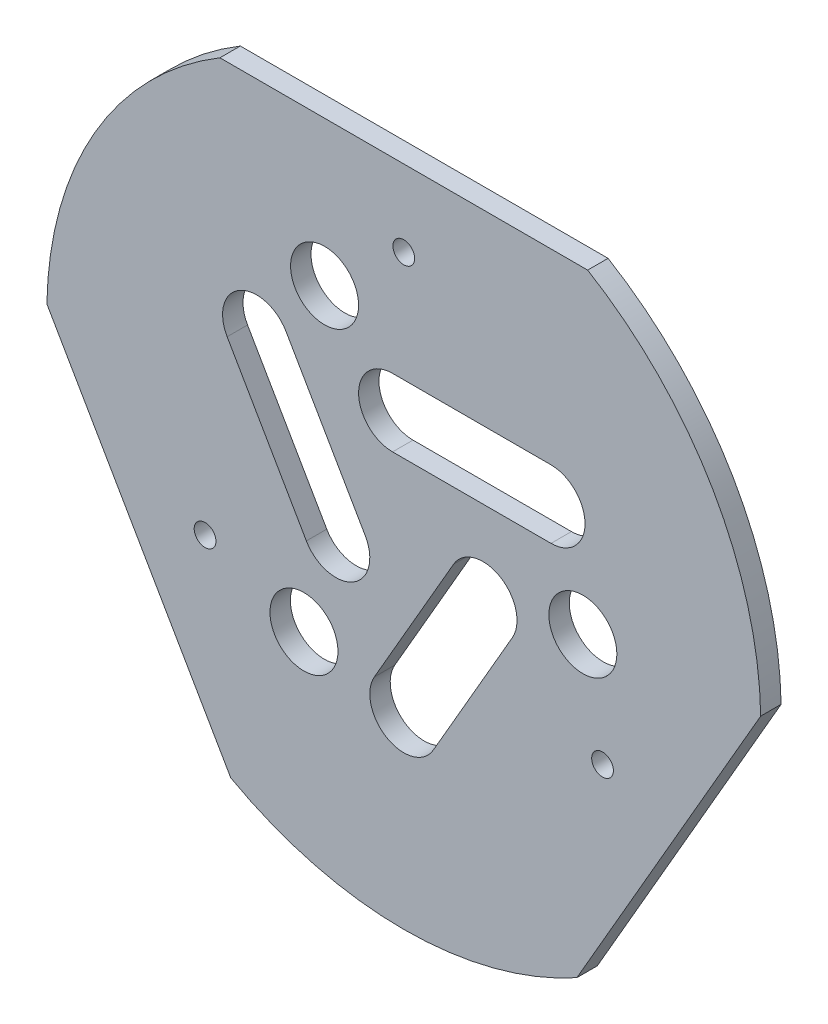
ISO-10303-21;
HEADER;
FILE_DESCRIPTION(('STEP AP214'),'2;1');
FILE_NAME('part.step','',(''),(''),'','','');
FILE_SCHEMA(('AUTOMOTIVE_DESIGN { 1 0 10303 214 1 1 1 1 }'));
ENDSEC;
DATA;
#1=APPLICATION_CONTEXT('core data for automotive mechanical design processes');
#2=APPLICATION_PROTOCOL_DEFINITION('international standard','automotive_design',2000,#1);
#3=PRODUCT_CONTEXT('',#1,'mechanical');
#4=PRODUCT('Part','Part','',(#3));
#5=PRODUCT_RELATED_PRODUCT_CATEGORY('part','',(#4));
#6=PRODUCT_DEFINITION_FORMATION('','',#4);
#7=PRODUCT_DEFINITION_CONTEXT('part definition',#1,'design');
#8=PRODUCT_DEFINITION('design','',#6,#7);
#9=PRODUCT_DEFINITION_SHAPE('','',#8);
#10=(LENGTH_UNIT() NAMED_UNIT(*) SI_UNIT(.MILLI.,.METRE.));
#11=(NAMED_UNIT(*) PLANE_ANGLE_UNIT() SI_UNIT($,.RADIAN.));
#12=(NAMED_UNIT(*) SI_UNIT($,.STERADIAN.) SOLID_ANGLE_UNIT());
#13=UNCERTAINTY_MEASURE_WITH_UNIT(LENGTH_MEASURE(1.E-05),#10,'distance_accuracy_value','');
#14=(GEOMETRIC_REPRESENTATION_CONTEXT(3) GLOBAL_UNCERTAINTY_ASSIGNED_CONTEXT((#13)) GLOBAL_UNIT_ASSIGNED_CONTEXT((#10,
#11,#12)) REPRESENTATION_CONTEXT('',''));
#15=CARTESIAN_POINT('',(0.,0.,0.));
#16=DIRECTION('',(0.,0.,1.));
#17=DIRECTION('',(1.,0.,0.));
#18=AXIS2_PLACEMENT_3D('',#15,#16,#17);
#19=CARTESIAN_POINT('',(0.,0.,1.5));
#20=DIRECTION('',(0.,0.,1.));
#21=DIRECTION('',(1.,0.,0.));
#22=AXIS2_PLACEMENT_3D('',#19,#20,#21);
#23=PLANE('',#22);
#24=CARTESIAN_POINT('',(-14.6824583655185,-21.9299159059052,1.5));
#25=DIRECTION('',(0.,0.,1.));
#26=DIRECTION('',(-0.500000000000004,0.866025403784436,0.));
#27=AXIS2_PLACEMENT_3D('',#24,#25,#26);
#28=CIRCLE('',#27,5.);
#29=CARTESIAN_POINT('',(-17.1824583655185,-17.599788886983,1.5));
#30=VERTEX_POINT('',#29);
#31=EDGE_CURVE('E442',#30,#30,#28,.T.);
#32=ORIENTED_EDGE('',*,*,#31,.F.);
#33=EDGE_LOOP('',(#32));
#34=FACE_BOUND('',#33,.T.);
#35=CARTESIAN_POINT('',(26.3330934601296,-1.75042398159359,1.5));
#36=DIRECTION('',(0.,0.,1.));
#37=DIRECTION('',(-0.499999999999992,-0.866025403784443,0.));
#38=AXIS2_PLACEMENT_3D('',#35,#36,#37);
#39=CIRCLE('',#38,5.);
#40=CARTESIAN_POINT('',(23.8330934601296,-6.08055100051581,1.5));
#41=VERTEX_POINT('',#40);
#42=EDGE_CURVE('E447',#41,#41,#39,.T.);
#43=ORIENTED_EDGE('',*,*,#42,.F.);
#44=EDGE_LOOP('',(#43));
#45=FACE_BOUND('',#44,.T.);
#46=CARTESIAN_POINT('',(-11.650635094611,23.680339887499,1.5));
#47=DIRECTION('',(0.,0.,1.));
#48=DIRECTION('',(1.,0.,0.));
#49=AXIS2_PLACEMENT_3D('',#46,#47,#48);
#50=CIRCLE('',#49,5.);
#51=CARTESIAN_POINT('',(-6.65063509461102,23.680339887499,1.5));
#52=VERTEX_POINT('',#51);
#53=EDGE_CURVE('E187',#52,#52,#50,.T.);
#54=ORIENTED_EDGE('',*,*,#53,.F.);
#55=EDGE_LOOP('',(#54));
#56=FACE_BOUND('',#55,.T.);
#57=DIRECTION('',(-0.499999999999996,-0.866025403784441,0.));
#58=VECTOR('',#57,1.);
#59=CARTESIAN_POINT('',(-4.33012701892209,-22.5,1.5));
#60=LINE('',#59,#58);
#61=CARTESIAN_POINT('',(7.32050807568879,-2.32050807568874,1.5));
#62=VERTEX_POINT('',#61);
#63=CARTESIAN_POINT('',(-4.33012701892209,-22.5,1.5));
#64=VERTEX_POINT('',#63);
#65=EDGE_CURVE('E182',#62,#64,#60,.T.);
#66=ORIENTED_EDGE('',*,*,#65,.F.);
#67=CARTESIAN_POINT('',(11.650635094611,-4.82050807568872,1.5));
#68=DIRECTION('',(0.,0.,1.));
#69=DIRECTION('',(-0.500000000000004,0.866025403784436,0.));
#70=AXIS2_PLACEMENT_3D('',#67,#68,#69);
#71=CIRCLE('',#70,5.);
#72=CARTESIAN_POINT('',(15.9807621135332,-7.3205080756887,1.5));
#73=VERTEX_POINT('',#72);
#74=EDGE_CURVE('E184',#73,#62,#71,.T.);
#75=ORIENTED_EDGE('',*,*,#74,.F.);
#76=DIRECTION('',(0.499999999999996,0.866025403784441,0.));
#77=VECTOR('',#76,1.);
#78=CARTESIAN_POINT('',(4.33012701892233,-27.5,1.5));
#79=LINE('',#78,#77);
#80=CARTESIAN_POINT('',(4.33012701892233,-27.5,1.5));
#81=VERTEX_POINT('',#80);
#82=EDGE_CURVE('E162',#81,#73,#79,.T.);
#83=ORIENTED_EDGE('',*,*,#82,.F.);
#84=CARTESIAN_POINT('',(0.,-25.,1.5));
#85=DIRECTION('',(0.,0.,1.));
#86=DIRECTION('',(1.,0.,0.));
#87=AXIS2_PLACEMENT_3D('',#84,#85,#86);
#88=CIRCLE('',#87,5.);
#89=EDGE_CURVE('E261',#64,#81,#88,.T.);
#90=ORIENTED_EDGE('',*,*,#89,.F.);
#91=EDGE_LOOP('',(#66,#75,#83,#90));
#92=FACE_BOUND('',#91,.T.);
#93=DIRECTION('',(1.,0.,0.));
#94=VECTOR('',#93,1.);
#95=CARTESIAN_POINT('',(21.6506350946109,7.5000000000002,1.5));
#96=LINE('',#95,#94);
#97=CARTESIAN_POINT('',(-1.65063509461104,7.49999999999998,1.5));
#98=VERTEX_POINT('',#97);
#99=CARTESIAN_POINT('',(21.6506350946109,7.5000000000002,1.5));
#100=VERTEX_POINT('',#99);
#101=EDGE_CURVE('E202',#98,#100,#96,.T.);
#102=ORIENTED_EDGE('',*,*,#101,.F.);
#103=CARTESIAN_POINT('',(-1.65063509461108,12.5,1.5));
#104=DIRECTION('',(0.,0.,1.));
#105=DIRECTION('',(-0.499999999999992,-0.866025403784443,0.));
#106=AXIS2_PLACEMENT_3D('',#103,#104,#105);
#107=CIRCLE('',#106,5.);
#108=CARTESIAN_POINT('',(-1.65063509461113,17.5,1.5));
#109=VERTEX_POINT('',#108);
#110=EDGE_CURVE('E212',#109,#98,#107,.T.);
#111=ORIENTED_EDGE('',*,*,#110,.F.);
#112=DIRECTION('',(-1.,0.,0.));
#113=VECTOR('',#112,1.);
#114=CARTESIAN_POINT('',(21.6506350946108,17.5000000000002,1.5));
#115=LINE('',#114,#113);
#116=CARTESIAN_POINT('',(21.6506350946108,17.5000000000002,1.5));
#117=VERTEX_POINT('',#116);
#118=EDGE_CURVE('E209',#117,#109,#115,.T.);
#119=ORIENTED_EDGE('',*,*,#118,.F.);
#120=CARTESIAN_POINT('',(21.650635094611,12.5,1.5));
#121=DIRECTION('',(0.,0.,1.));
#122=DIRECTION('',(1.,0.,0.));
#123=AXIS2_PLACEMENT_3D('',#120,#121,#122);
#124=CIRCLE('',#123,5.);
#125=EDGE_CURVE('E250',#100,#117,#124,.T.);
#126=ORIENTED_EDGE('',*,*,#125,.F.);
#127=EDGE_LOOP('',(#102,#111,#119,#126));
#128=FACE_BOUND('',#127,.T.);
#129=DIRECTION('',(-0.5,0.866025403784439,0.));
#130=VECTOR('',#129,1.);
#131=CARTESIAN_POINT('',(-17.3205080756888,15.,1.5));
#132=LINE('',#131,#130);
#133=CARTESIAN_POINT('',(-5.66987298107781,-5.17949192431123,1.5));
#134=VERTEX_POINT('',#133);
#135=CARTESIAN_POINT('',(-17.3205080756888,15.,1.5));
#136=VERTEX_POINT('',#135);
#137=EDGE_CURVE('E228',#134,#136,#132,.T.);
#138=ORIENTED_EDGE('',*,*,#137,.F.);
#139=CARTESIAN_POINT('',(-10.,-7.67949192431123,1.5));
#140=DIRECTION('',(0.,0.,1.));
#141=DIRECTION('',(1.,0.,0.));
#142=AXIS2_PLACEMENT_3D('',#139,#140,#141);
#143=CIRCLE('',#142,5.);
#144=CARTESIAN_POINT('',(-14.3301270189222,-10.1794919243112,1.5));
#145=VERTEX_POINT('',#144);
#146=EDGE_CURVE('E237',#145,#134,#143,.T.);
#147=ORIENTED_EDGE('',*,*,#146,.F.);
#148=DIRECTION('',(0.5,-0.866025403784438,0.));
#149=VECTOR('',#148,1.);
#150=CARTESIAN_POINT('',(-25.9807621135332,9.99999999999999,1.5));
#151=LINE('',#150,#149);
#152=CARTESIAN_POINT('',(-25.9807621135332,9.99999999999999,1.5));
#153=VERTEX_POINT('',#152);
#154=EDGE_CURVE('E197',#153,#145,#151,.T.);
#155=ORIENTED_EDGE('',*,*,#154,.F.);
#156=CARTESIAN_POINT('',(-21.650635094611,12.5,1.5));
#157=DIRECTION('',(0.,0.,1.));
#158=DIRECTION('',(1.,0.,0.));
#159=AXIS2_PLACEMENT_3D('',#156,#157,#158);
#160=CIRCLE('',#159,5.);
#161=EDGE_CURVE('E256',#136,#153,#160,.T.);
#162=ORIENTED_EDGE('',*,*,#161,.F.);
#163=EDGE_LOOP('',(#138,#147,#155,#162));
#164=FACE_BOUND('',#163,.T.);
#165=CARTESIAN_POINT('',(-29.2283573777248,-16.875,1.5));
#166=DIRECTION('',(0.,0.,1.));
#167=DIRECTION('',(1.,0.,0.));
#168=AXIS2_PLACEMENT_3D('',#165,#166,#167);
#169=CIRCLE('',#168,1.6);
#170=CARTESIAN_POINT('',(-27.6283573777248,-16.875,1.5));
#171=VERTEX_POINT('',#170);
#172=EDGE_CURVE('E266',#171,#171,#169,.T.);
#173=ORIENTED_EDGE('',*,*,#172,.F.);
#174=EDGE_LOOP('',(#173));
#175=FACE_BOUND('',#174,.T.);
#176=CARTESIAN_POINT('',(0.,33.75,1.5));
#177=DIRECTION('',(0.,0.,1.));
#178=DIRECTION('',(1.,0.,0.));
#179=AXIS2_PLACEMENT_3D('',#176,#177,#178);
#180=CIRCLE('',#179,1.6);
#181=CARTESIAN_POINT('',(1.6,33.75,1.5));
#182=VERTEX_POINT('',#181);
#183=EDGE_CURVE('E278',#182,#182,#180,.T.);
#184=ORIENTED_EDGE('',*,*,#183,.F.);
#185=EDGE_LOOP('',(#184));
#186=FACE_BOUND('',#185,.T.);
#187=CARTESIAN_POINT('',(0.,0.,1.5));
#188=DIRECTION('',(0.,0.,1.));
#189=DIRECTION('',(1.,0.,0.));
#190=AXIS2_PLACEMENT_3D('',#187,#188,#189);
#191=CIRCLE('',#190,52.5);
#192=CARTESIAN_POINT('',(-27.0416345659799,45.,1.5));
#193=VERTEX_POINT('',#192);
#194=CARTESIAN_POINT('',(-52.4919604532897,0.91874249399394,1.5));
#195=VERTEX_POINT('',#194);
#196=EDGE_CURVE('E284',#193,#195,#191,.T.);
#197=ORIENTED_EDGE('',*,*,#196,.T.);
#198=DIRECTION('',(0.500000000000001,-0.866025403784438,0.));
#199=VECTOR('',#198,1.);
#200=CARTESIAN_POINT('',(-52.4919604532897,0.91874249399394,1.5));
#201=LINE('',#200,#199);
#202=CARTESIAN_POINT('',(-25.4503258873098,-45.918742493994,1.5));
#203=VERTEX_POINT('',#202);
#204=EDGE_CURVE('E287',#195,#203,#201,.T.);
#205=ORIENTED_EDGE('',*,*,#204,.T.);
#206=CARTESIAN_POINT('',(0.,0.,1.5));
#207=DIRECTION('',(0.,0.,1.));
#208=DIRECTION('',(1.,0.,0.));
#209=AXIS2_PLACEMENT_3D('',#206,#207,#208);
#210=CIRCLE('',#209,52.5);
#211=CARTESIAN_POINT('',(25.4503258873098,-45.918742493994,1.5));
#212=VERTEX_POINT('',#211);
#213=EDGE_CURVE('E290',#203,#212,#210,.T.);
#214=ORIENTED_EDGE('',*,*,#213,.T.);
#215=DIRECTION('',(0.5,0.866025403784439,0.));
#216=VECTOR('',#215,1.);
#217=CARTESIAN_POINT('',(25.4503258873098,-45.918742493994,1.5));
#218=LINE('',#217,#216);
#219=CARTESIAN_POINT('',(52.4919604532897,0.918742493994013,1.5));
#220=VERTEX_POINT('',#219);
#221=EDGE_CURVE('E292',#212,#220,#218,.T.);
#222=ORIENTED_EDGE('',*,*,#221,.T.);
#223=CARTESIAN_POINT('',(0.,0.,1.5));
#224=DIRECTION('',(0.,0.,1.));
#225=DIRECTION('',(1.,0.,0.));
#226=AXIS2_PLACEMENT_3D('',#223,#224,#225);
#227=CIRCLE('',#226,52.5);
#228=CARTESIAN_POINT('',(27.0416345659799,45.,1.5));
#229=VERTEX_POINT('',#228);
#230=EDGE_CURVE('E294',#220,#229,#227,.T.);
#231=ORIENTED_EDGE('',*,*,#230,.T.);
#232=DIRECTION('',(-1.,0.,0.));
#233=VECTOR('',#232,1.);
#234=CARTESIAN_POINT('',(27.0416345659799,45.,1.5));
#235=LINE('',#234,#233);
#236=EDGE_CURVE('E296',#229,#193,#235,.T.);
#237=ORIENTED_EDGE('',*,*,#236,.T.);
#238=EDGE_LOOP('',(#197,#205,#214,#222,#231,#237));
#239=FACE_BOUND('',#238,.T.);
#240=CARTESIAN_POINT('',(29.2283573777248,-16.875,1.5));
#241=DIRECTION('',(0.,0.,1.));
#242=DIRECTION('',(1.,0.,0.));
#243=AXIS2_PLACEMENT_3D('',#240,#241,#242);
#244=CIRCLE('',#243,1.6);
#245=CARTESIAN_POINT('',(30.8283573777248,-16.875,1.5));
#246=VERTEX_POINT('',#245);
#247=EDGE_CURVE('E272',#246,#246,#244,.T.);
#248=ORIENTED_EDGE('',*,*,#247,.F.);
#249=EDGE_LOOP('',(#248));
#250=FACE_BOUND('',#249,.T.);
#251=ADVANCED_FACE('F35',(#34,#45,#56,#92,#128,#164,#175,#186,#239,#250),#23,.T.);
#252=CARTESIAN_POINT('',(0.,0.,-1.5));
#253=DIRECTION('',(0.,0.,1.));
#254=DIRECTION('',(1.,0.,0.));
#255=AXIS2_PLACEMENT_3D('',#252,#253,#254);
#256=PLANE('',#255);
#257=CARTESIAN_POINT('',(-14.6824583655185,-21.9299159059052,-1.5));
#258=DIRECTION('',(0.,0.,1.));
#259=DIRECTION('',(-0.500000000000004,0.866025403784436,0.));
#260=AXIS2_PLACEMENT_3D('',#257,#258,#259);
#261=CIRCLE('',#260,5.);
#262=CARTESIAN_POINT('',(-17.1824583655185,-17.599788886983,-1.5));
#263=VERTEX_POINT('',#262);
#264=EDGE_CURVE('E440',#263,#263,#261,.T.);
#265=ORIENTED_EDGE('',*,*,#264,.T.);
#266=EDGE_LOOP('',(#265));
#267=FACE_BOUND('',#266,.T.);
#268=CARTESIAN_POINT('',(26.3330934601296,-1.75042398159359,-1.5));
#269=DIRECTION('',(0.,0.,1.));
#270=DIRECTION('',(-0.499999999999992,-0.866025403784443,0.));
#271=AXIS2_PLACEMENT_3D('',#268,#269,#270);
#272=CIRCLE('',#271,5.);
#273=CARTESIAN_POINT('',(23.8330934601296,-6.08055100051581,-1.5));
#274=VERTEX_POINT('',#273);
#275=EDGE_CURVE('E443',#274,#274,#272,.T.);
#276=ORIENTED_EDGE('',*,*,#275,.T.);
#277=EDGE_LOOP('',(#276));
#278=FACE_BOUND('',#277,.T.);
#279=CARTESIAN_POINT('',(-11.650635094611,23.680339887499,-1.5));
#280=DIRECTION('',(0.,0.,1.));
#281=DIRECTION('',(1.,0.,0.));
#282=AXIS2_PLACEMENT_3D('',#279,#280,#281);
#283=CIRCLE('',#282,5.);
#284=CARTESIAN_POINT('',(-6.65063509461102,23.680339887499,-1.5));
#285=VERTEX_POINT('',#284);
#286=EDGE_CURVE('E213',#285,#285,#283,.T.);
#287=ORIENTED_EDGE('',*,*,#286,.T.);
#288=EDGE_LOOP('',(#287));
#289=FACE_BOUND('',#288,.T.);
#290=CARTESIAN_POINT('',(0.,0.,-1.5));
#291=DIRECTION('',(0.,0.,1.));
#292=DIRECTION('',(1.,0.,0.));
#293=AXIS2_PLACEMENT_3D('',#290,#291,#292);
#294=CIRCLE('',#293,52.5);
#295=CARTESIAN_POINT('',(-27.0416345659799,45.,-1.5));
#296=VERTEX_POINT('',#295);
#297=CARTESIAN_POINT('',(-52.4919604532897,0.91874249399394,-1.5));
#298=VERTEX_POINT('',#297);
#299=EDGE_CURVE('E281',#296,#298,#294,.T.);
#300=ORIENTED_EDGE('',*,*,#299,.F.);
#301=DIRECTION('',(-1.,0.,0.));
#302=VECTOR('',#301,1.);
#303=CARTESIAN_POINT('',(27.0416345659799,45.,-1.5));
#304=LINE('',#303,#302);
#305=CARTESIAN_POINT('',(27.0416345659799,45.,-1.5));
#306=VERTEX_POINT('',#305);
#307=EDGE_CURVE('E288',#306,#296,#304,.T.);
#308=ORIENTED_EDGE('',*,*,#307,.F.);
#309=CARTESIAN_POINT('',(0.,0.,-1.5));
#310=DIRECTION('',(0.,0.,1.));
#311=DIRECTION('',(1.,0.,0.));
#312=AXIS2_PLACEMENT_3D('',#309,#310,#311);
#313=CIRCLE('',#312,52.5);
#314=CARTESIAN_POINT('',(52.4919604532897,0.918742493994013,-1.5));
#315=VERTEX_POINT('',#314);
#316=EDGE_CURVE('E307',#315,#306,#313,.T.);
#317=ORIENTED_EDGE('',*,*,#316,.F.);
#318=DIRECTION('',(0.5,0.866025403784439,0.));
#319=VECTOR('',#318,1.);
#320=CARTESIAN_POINT('',(25.4503258873098,-45.918742493994,-1.5));
#321=LINE('',#320,#319);
#322=CARTESIAN_POINT('',(25.4503258873098,-45.918742493994,-1.5));
#323=VERTEX_POINT('',#322);
#324=EDGE_CURVE('E305',#323,#315,#321,.T.);
#325=ORIENTED_EDGE('',*,*,#324,.F.);
#326=CARTESIAN_POINT('',(0.,0.,-1.5));
#327=DIRECTION('',(0.,0.,1.));
#328=DIRECTION('',(1.,0.,0.));
#329=AXIS2_PLACEMENT_3D('',#326,#327,#328);
#330=CIRCLE('',#329,52.5);
#331=CARTESIAN_POINT('',(-25.4503258873098,-45.918742493994,-1.5));
#332=VERTEX_POINT('',#331);
#333=EDGE_CURVE('E303',#332,#323,#330,.T.);
#334=ORIENTED_EDGE('',*,*,#333,.F.);
#335=DIRECTION('',(0.500000000000001,-0.866025403784438,0.));
#336=VECTOR('',#335,1.);
#337=CARTESIAN_POINT('',(-52.4919604532897,0.91874249399394,-1.5));
#338=LINE('',#337,#336);
#339=EDGE_CURVE('E301',#298,#332,#338,.T.);
#340=ORIENTED_EDGE('',*,*,#339,.F.);
#341=EDGE_LOOP('',(#300,#308,#317,#325,#334,#340));
#342=FACE_BOUND('',#341,.T.);
#343=CARTESIAN_POINT('',(0.,33.75,-1.5));
#344=DIRECTION('',(0.,0.,1.));
#345=DIRECTION('',(1.,0.,0.));
#346=AXIS2_PLACEMENT_3D('',#343,#344,#345);
#347=CIRCLE('',#346,1.6);
#348=CARTESIAN_POINT('',(1.6,33.75,-1.5));
#349=VERTEX_POINT('',#348);
#350=EDGE_CURVE('E275',#349,#349,#347,.T.);
#351=ORIENTED_EDGE('',*,*,#350,.T.);
#352=EDGE_LOOP('',(#351));
#353=FACE_BOUND('',#352,.T.);
#354=CARTESIAN_POINT('',(29.2283573777248,-16.875,-1.5));
#355=DIRECTION('',(0.,0.,1.));
#356=DIRECTION('',(1.,0.,0.));
#357=AXIS2_PLACEMENT_3D('',#354,#355,#356);
#358=CIRCLE('',#357,1.6);
#359=CARTESIAN_POINT('',(30.8283573777248,-16.875,-1.5));
#360=VERTEX_POINT('',#359);
#361=EDGE_CURVE('E269',#360,#360,#358,.T.);
#362=ORIENTED_EDGE('',*,*,#361,.T.);
#363=EDGE_LOOP('',(#362));
#364=FACE_BOUND('',#363,.T.);
#365=CARTESIAN_POINT('',(-29.2283573777248,-16.875,-1.5));
#366=DIRECTION('',(0.,0.,1.));
#367=DIRECTION('',(1.,0.,0.));
#368=AXIS2_PLACEMENT_3D('',#365,#366,#367);
#369=CIRCLE('',#368,1.6);
#370=CARTESIAN_POINT('',(-27.6283573777248,-16.875,-1.5));
#371=VERTEX_POINT('',#370);
#372=EDGE_CURVE('E264',#371,#371,#369,.T.);
#373=ORIENTED_EDGE('',*,*,#372,.T.);
#374=EDGE_LOOP('',(#373));
#375=FACE_BOUND('',#374,.T.);
#376=CARTESIAN_POINT('',(11.650635094611,-4.82050807568872,-1.5));
#377=DIRECTION('',(0.,0.,1.));
#378=DIRECTION('',(-0.500000000000004,0.866025403784436,0.));
#379=AXIS2_PLACEMENT_3D('',#376,#377,#378);
#380=CIRCLE('',#379,5.);
#381=CARTESIAN_POINT('',(15.9807621135332,-7.3205080756887,-1.5));
#382=VERTEX_POINT('',#381);
#383=CARTESIAN_POINT('',(7.32050807568879,-2.32050807568874,-1.5));
#384=VERTEX_POINT('',#383);
#385=EDGE_CURVE('E170',#382,#384,#380,.T.);
#386=ORIENTED_EDGE('',*,*,#385,.T.);
#387=DIRECTION('',(-0.499999999999996,-0.866025403784441,0.));
#388=VECTOR('',#387,1.);
#389=CARTESIAN_POINT('',(-4.33012701892209,-22.5,-1.5));
#390=LINE('',#389,#388);
#391=CARTESIAN_POINT('',(-4.33012701892209,-22.5,-1.5));
#392=VERTEX_POINT('',#391);
#393=EDGE_CURVE('E175',#384,#392,#390,.T.);
#394=ORIENTED_EDGE('',*,*,#393,.T.);
#395=CARTESIAN_POINT('',(0.,-25.,-1.5));
#396=DIRECTION('',(0.,0.,1.));
#397=DIRECTION('',(1.,0.,0.));
#398=AXIS2_PLACEMENT_3D('',#395,#396,#397);
#399=CIRCLE('',#398,5.);
#400=CARTESIAN_POINT('',(4.33012701892223,-27.4999999999999,-1.5));
#401=VERTEX_POINT('',#400);
#402=EDGE_CURVE('E181',#392,#401,#399,.T.);
#403=ORIENTED_EDGE('',*,*,#402,.T.);
#404=DIRECTION('',(0.499999999999996,0.866025403784441,0.));
#405=VECTOR('',#404,1.);
#406=CARTESIAN_POINT('',(4.33012701892233,-27.5,-1.5));
#407=LINE('',#406,#405);
#408=EDGE_CURVE('E50',#401,#382,#407,.T.);
#409=ORIENTED_EDGE('',*,*,#408,.T.);
#410=EDGE_LOOP('',(#386,#394,#403,#409));
#411=FACE_BOUND('',#410,.T.);
#412=CARTESIAN_POINT('',(-10.,-7.67949192431123,-1.5));
#413=DIRECTION('',(0.,0.,1.));
#414=DIRECTION('',(1.,0.,0.));
#415=AXIS2_PLACEMENT_3D('',#412,#413,#414);
#416=CIRCLE('',#415,5.);
#417=CARTESIAN_POINT('',(-14.3301270189222,-10.1794919243112,-1.5));
#418=VERTEX_POINT('',#417);
#419=CARTESIAN_POINT('',(-5.66987298107781,-5.17949192431123,-1.5));
#420=VERTEX_POINT('',#419);
#421=EDGE_CURVE('E227',#418,#420,#416,.T.);
#422=ORIENTED_EDGE('',*,*,#421,.T.);
#423=DIRECTION('',(-0.5,0.866025403784439,0.));
#424=VECTOR('',#423,1.);
#425=CARTESIAN_POINT('',(-17.3205080756888,15.,-1.5));
#426=LINE('',#425,#424);
#427=CARTESIAN_POINT('',(-17.3205080756888,15.,-1.5));
#428=VERTEX_POINT('',#427);
#429=EDGE_CURVE('E231',#420,#428,#426,.T.);
#430=ORIENTED_EDGE('',*,*,#429,.T.);
#431=CARTESIAN_POINT('',(-21.650635094611,12.5,-1.5));
#432=DIRECTION('',(0.,0.,1.));
#433=DIRECTION('',(1.,0.,0.));
#434=AXIS2_PLACEMENT_3D('',#431,#432,#433);
#435=CIRCLE('',#434,5.);
#436=CARTESIAN_POINT('',(-25.9807621135332,9.99999999999999,-1.5));
#437=VERTEX_POINT('',#436);
#438=EDGE_CURVE('E253',#428,#437,#435,.T.);
#439=ORIENTED_EDGE('',*,*,#438,.T.);
#440=DIRECTION('',(0.5,-0.866025403784438,0.));
#441=VECTOR('',#440,1.);
#442=CARTESIAN_POINT('',(-25.9807621135332,9.99999999999999,-1.5));
#443=LINE('',#442,#441);
#444=EDGE_CURVE('E224',#437,#418,#443,.T.);
#445=ORIENTED_EDGE('',*,*,#444,.T.);
#446=EDGE_LOOP('',(#422,#430,#439,#445));
#447=FACE_BOUND('',#446,.T.);
#448=CARTESIAN_POINT('',(-1.65063509461108,12.5,-1.5));
#449=DIRECTION('',(0.,0.,1.));
#450=DIRECTION('',(-0.499999999999992,-0.866025403784443,0.));
#451=AXIS2_PLACEMENT_3D('',#448,#449,#450);
#452=CIRCLE('',#451,5.);
#453=CARTESIAN_POINT('',(-1.65063509461113,17.5,-1.5));
#454=VERTEX_POINT('',#453);
#455=CARTESIAN_POINT('',(-1.65063509461104,7.49999999999998,-1.5));
#456=VERTEX_POINT('',#455);
#457=EDGE_CURVE('E201',#454,#456,#452,.T.);
#458=ORIENTED_EDGE('',*,*,#457,.T.);
#459=DIRECTION('',(1.,0.,0.));
#460=VECTOR('',#459,1.);
#461=CARTESIAN_POINT('',(21.6506350946109,7.5000000000002,-1.5));
#462=LINE('',#461,#460);
#463=CARTESIAN_POINT('',(21.6506350946109,7.5000000000002,-1.5));
#464=VERTEX_POINT('',#463);
#465=EDGE_CURVE('E205',#456,#464,#462,.T.);
#466=ORIENTED_EDGE('',*,*,#465,.T.);
#467=CARTESIAN_POINT('',(21.650635094611,12.5,-1.5));
#468=DIRECTION('',(0.,0.,1.));
#469=DIRECTION('',(1.,0.,0.));
#470=AXIS2_PLACEMENT_3D('',#467,#468,#469);
#471=CIRCLE('',#470,5.);
#472=CARTESIAN_POINT('',(21.6506350946108,17.5,-1.5));
#473=VERTEX_POINT('',#472);
#474=EDGE_CURVE('E244',#464,#473,#471,.T.);
#475=ORIENTED_EDGE('',*,*,#474,.T.);
#476=DIRECTION('',(-1.,0.,0.));
#477=VECTOR('',#476,1.);
#478=CARTESIAN_POINT('',(21.6506350946108,17.5000000000002,-1.5));
#479=LINE('',#478,#477);
#480=EDGE_CURVE('E58',#473,#454,#479,.T.);
#481=ORIENTED_EDGE('',*,*,#480,.T.);
#482=EDGE_LOOP('',(#458,#466,#475,#481));
#483=FACE_BOUND('',#482,.T.);
#484=ADVANCED_FACE('F178',(#267,#278,#289,#342,#353,#364,#375,#411,#447,#483),#256,.F.);
#485=CARTESIAN_POINT('',(0.,0.,1.5));
#486=DIRECTION('',(0.,0.,-1.));
#487=DIRECTION('',(-1.,0.,0.));
#488=AXIS2_PLACEMENT_3D('',#485,#486,#487);
#489=CYLINDRICAL_SURFACE('',#488,52.5);
#490=ORIENTED_EDGE('',*,*,#299,.T.);
#491=DIRECTION('',(0.,0.,-1.));
#492=VECTOR('',#491,1.);
#493=CARTESIAN_POINT('',(-52.4919604532897,0.91874249399394,1.5));
#494=LINE('',#493,#492);
#495=EDGE_CURVE('E11',#195,#298,#494,.T.);
#496=ORIENTED_EDGE('',*,*,#495,.F.);
#497=ORIENTED_EDGE('',*,*,#196,.F.);
#498=DIRECTION('',(0.,0.,-1.));
#499=VECTOR('',#498,1.);
#500=CARTESIAN_POINT('',(-27.0416345659799,45.,1.5));
#501=LINE('',#500,#499);
#502=EDGE_CURVE('E298',#193,#296,#501,.T.);
#503=ORIENTED_EDGE('',*,*,#502,.T.);
#504=EDGE_LOOP('',(#490,#496,#497,#503));
#505=FACE_BOUND('',#504,.T.);
#506=ADVANCED_FACE('F37',(#505),#489,.T.);
#507=CARTESIAN_POINT('',(-52.4919604532897,0.91874249399394,1.5));
#508=DIRECTION('',(0.866025403784438,0.500000000000001,0.));
#509=DIRECTION('',(-0.500000000000001,0.866025403784438,0.));
#510=AXIS2_PLACEMENT_3D('',#507,#508,#509);
#511=PLANE('',#510);
#512=ORIENTED_EDGE('',*,*,#339,.T.);
#513=DIRECTION('',(0.,0.,-1.));
#514=VECTOR('',#513,1.);
#515=CARTESIAN_POINT('',(-25.4503258873098,-45.918742493994,1.5));
#516=LINE('',#515,#514);
#517=EDGE_CURVE('E43',#203,#332,#516,.T.);
#518=ORIENTED_EDGE('',*,*,#517,.F.);
#519=ORIENTED_EDGE('',*,*,#204,.F.);
#520=ORIENTED_EDGE('',*,*,#495,.T.);
#521=EDGE_LOOP('',(#512,#518,#519,#520));
#522=FACE_BOUND('',#521,.T.);
#523=ADVANCED_FACE('F348',(#522),#511,.F.);
#524=CARTESIAN_POINT('',(0.,0.,1.5));
#525=DIRECTION('',(0.,0.,-1.));
#526=DIRECTION('',(-1.,0.,0.));
#527=AXIS2_PLACEMENT_3D('',#524,#525,#526);
#528=CYLINDRICAL_SURFACE('',#527,52.5);
#529=ORIENTED_EDGE('',*,*,#333,.T.);
#530=DIRECTION('',(0.,0.,-1.));
#531=VECTOR('',#530,1.);
#532=CARTESIAN_POINT('',(25.4503258873098,-45.918742493994,1.5));
#533=LINE('',#532,#531);
#534=EDGE_CURVE('E318',#212,#323,#533,.T.);
#535=ORIENTED_EDGE('',*,*,#534,.F.);
#536=ORIENTED_EDGE('',*,*,#213,.F.);
#537=ORIENTED_EDGE('',*,*,#517,.T.);
#538=EDGE_LOOP('',(#529,#535,#536,#537));
#539=FACE_BOUND('',#538,.T.);
#540=ADVANCED_FACE('F325',(#539),#528,.T.);
#541=CARTESIAN_POINT('',(25.4503258873098,-45.918742493994,1.5));
#542=DIRECTION('',(-0.866025403784439,0.5,0.));
#543=DIRECTION('',(-0.5,-0.866025403784439,0.));
#544=AXIS2_PLACEMENT_3D('',#541,#542,#543);
#545=PLANE('',#544);
#546=ORIENTED_EDGE('',*,*,#324,.T.);
#547=DIRECTION('',(0.,0.,-1.));
#548=VECTOR('',#547,1.);
#549=CARTESIAN_POINT('',(52.4919604532897,0.918742493994013,1.5));
#550=LINE('',#549,#548);
#551=EDGE_CURVE('E315',#220,#315,#550,.T.);
#552=ORIENTED_EDGE('',*,*,#551,.F.);
#553=ORIENTED_EDGE('',*,*,#221,.F.);
#554=ORIENTED_EDGE('',*,*,#534,.T.);
#555=EDGE_LOOP('',(#546,#552,#553,#554));
#556=FACE_BOUND('',#555,.T.);
#557=ADVANCED_FACE('F336',(#556),#545,.F.);
#558=CARTESIAN_POINT('',(0.,0.,1.5));
#559=DIRECTION('',(0.,0.,-1.));
#560=DIRECTION('',(-1.,0.,0.));
#561=AXIS2_PLACEMENT_3D('',#558,#559,#560);
#562=CYLINDRICAL_SURFACE('',#561,52.5);
#563=ORIENTED_EDGE('',*,*,#316,.T.);
#564=DIRECTION('',(0.,0.,-1.));
#565=VECTOR('',#564,1.);
#566=CARTESIAN_POINT('',(27.0416345659799,45.,1.5));
#567=LINE('',#566,#565);
#568=EDGE_CURVE('E312',#229,#306,#567,.T.);
#569=ORIENTED_EDGE('',*,*,#568,.F.);
#570=ORIENTED_EDGE('',*,*,#230,.F.);
#571=ORIENTED_EDGE('',*,*,#551,.T.);
#572=EDGE_LOOP('',(#563,#569,#570,#571));
#573=FACE_BOUND('',#572,.T.);
#574=ADVANCED_FACE('F340',(#573),#562,.T.);
#575=CARTESIAN_POINT('',(27.0416345659799,45.,1.5));
#576=DIRECTION('',(0.,-1.,0.));
#577=DIRECTION('',(0.,0.,-1.));
#578=AXIS2_PLACEMENT_3D('',#575,#576,#577);
#579=PLANE('',#578);
#580=ORIENTED_EDGE('',*,*,#307,.T.);
#581=ORIENTED_EDGE('',*,*,#502,.F.);
#582=ORIENTED_EDGE('',*,*,#236,.F.);
#583=ORIENTED_EDGE('',*,*,#568,.T.);
#584=EDGE_LOOP('',(#580,#581,#582,#583));
#585=FACE_BOUND('',#584,.T.);
#586=ADVANCED_FACE('F351',(#585),#579,.F.);
#587=CARTESIAN_POINT('',(0.,33.75,1.5));
#588=DIRECTION('',(0.,0.,-1.));
#589=DIRECTION('',(-1.,0.,0.));
#590=AXIS2_PLACEMENT_3D('',#587,#588,#589);
#591=CYLINDRICAL_SURFACE('',#590,1.6);
#592=ORIENTED_EDGE('',*,*,#183,.T.);
#593=EDGE_LOOP('',(#592));
#594=FACE_BOUND('',#593,.T.);
#595=ORIENTED_EDGE('',*,*,#350,.F.);
#596=EDGE_LOOP('',(#595));
#597=FACE_BOUND('',#596,.T.);
#598=ADVANCED_FACE('F353',(#594,#597),#591,.F.);
#599=CARTESIAN_POINT('',(29.2283573777248,-16.875,1.5));
#600=DIRECTION('',(0.,0.,-1.));
#601=DIRECTION('',(-1.,0.,0.));
#602=AXIS2_PLACEMENT_3D('',#599,#600,#601);
#603=CYLINDRICAL_SURFACE('',#602,1.6);
#604=ORIENTED_EDGE('',*,*,#247,.T.);
#605=EDGE_LOOP('',(#604));
#606=FACE_BOUND('',#605,.T.);
#607=ORIENTED_EDGE('',*,*,#361,.F.);
#608=EDGE_LOOP('',(#607));
#609=FACE_BOUND('',#608,.T.);
#610=ADVANCED_FACE('F359',(#606,#609),#603,.F.);
#611=CARTESIAN_POINT('',(-29.2283573777248,-16.875,1.5));
#612=DIRECTION('',(0.,0.,-1.));
#613=DIRECTION('',(-1.,0.,0.));
#614=AXIS2_PLACEMENT_3D('',#611,#612,#613);
#615=CYLINDRICAL_SURFACE('',#614,1.6);
#616=ORIENTED_EDGE('',*,*,#172,.T.);
#617=EDGE_LOOP('',(#616));
#618=FACE_BOUND('',#617,.T.);
#619=ORIENTED_EDGE('',*,*,#372,.F.);
#620=EDGE_LOOP('',(#619));
#621=FACE_BOUND('',#620,.T.);
#622=ADVANCED_FACE('F376',(#618,#621),#615,.F.);
#623=CARTESIAN_POINT('',(0.,-25.,1.5));
#624=DIRECTION('',(0.,0.,-1.));
#625=DIRECTION('',(-1.,0.,0.));
#626=AXIS2_PLACEMENT_3D('',#623,#624,#625);
#627=CYLINDRICAL_SURFACE('',#626,5.);
#628=DIRECTION('',(0.,0.,1.));
#629=VECTOR('',#628,1.);
#630=CARTESIAN_POINT('',(-4.33012701892209,-22.5,-1.5));
#631=LINE('',#630,#629);
#632=EDGE_CURVE('E194',#392,#64,#631,.T.);
#633=ORIENTED_EDGE('',*,*,#632,.T.);
#634=ORIENTED_EDGE('',*,*,#89,.T.);
#635=DIRECTION('',(0.,0.,1.));
#636=VECTOR('',#635,1.);
#637=CARTESIAN_POINT('',(4.33012701892233,-27.5,-1.5));
#638=LINE('',#637,#636);
#639=EDGE_CURVE('E167',#401,#81,#638,.T.);
#640=ORIENTED_EDGE('',*,*,#639,.F.);
#641=ORIENTED_EDGE('',*,*,#402,.F.);
#642=EDGE_LOOP('',(#633,#634,#640,#641));
#643=FACE_BOUND('',#642,.T.);
#644=ADVANCED_FACE('F380',(#643),#627,.F.);
#645=CARTESIAN_POINT('',(-21.650635094611,12.5,1.5));
#646=DIRECTION('',(0.,0.,-1.));
#647=DIRECTION('',(-1.,0.,0.));
#648=AXIS2_PLACEMENT_3D('',#645,#646,#647);
#649=CYLINDRICAL_SURFACE('',#648,5.);
#650=DIRECTION('',(0.,0.,1.));
#651=VECTOR('',#650,1.);
#652=CARTESIAN_POINT('',(-17.3205080756888,15.,-1.5));
#653=LINE('',#652,#651);
#654=EDGE_CURVE('E241',#428,#136,#653,.T.);
#655=ORIENTED_EDGE('',*,*,#654,.T.);
#656=ORIENTED_EDGE('',*,*,#161,.T.);
#657=DIRECTION('',(0.,0.,1.));
#658=VECTOR('',#657,1.);
#659=CARTESIAN_POINT('',(-25.9807621135332,9.99999999999999,-1.5));
#660=LINE('',#659,#658);
#661=EDGE_CURVE('E234',#437,#153,#660,.T.);
#662=ORIENTED_EDGE('',*,*,#661,.F.);
#663=ORIENTED_EDGE('',*,*,#438,.F.);
#664=EDGE_LOOP('',(#655,#656,#662,#663));
#665=FACE_BOUND('',#664,.T.);
#666=ADVANCED_FACE('F384',(#665),#649,.F.);
#667=CARTESIAN_POINT('',(21.650635094611,12.5,1.5));
#668=DIRECTION('',(0.,0.,-1.));
#669=DIRECTION('',(-1.,0.,0.));
#670=AXIS2_PLACEMENT_3D('',#667,#668,#669);
#671=CYLINDRICAL_SURFACE('',#670,5.);
#672=DIRECTION('',(0.,0.,1.));
#673=VECTOR('',#672,1.);
#674=CARTESIAN_POINT('',(21.6506350946109,7.5000000000002,-1.5));
#675=LINE('',#674,#673);
#676=EDGE_CURVE('E192',#464,#100,#675,.T.);
#677=ORIENTED_EDGE('',*,*,#676,.T.);
#678=ORIENTED_EDGE('',*,*,#125,.T.);
#679=DIRECTION('',(0.,0.,1.));
#680=VECTOR('',#679,1.);
#681=CARTESIAN_POINT('',(21.6506350946108,17.5000000000002,-1.5));
#682=LINE('',#681,#680);
#683=EDGE_CURVE('E208',#473,#117,#682,.T.);
#684=ORIENTED_EDGE('',*,*,#683,.F.);
#685=ORIENTED_EDGE('',*,*,#474,.F.);
#686=EDGE_LOOP('',(#677,#678,#684,#685));
#687=FACE_BOUND('',#686,.T.);
#688=ADVANCED_FACE('F388',(#687),#671,.F.);
#689=CARTESIAN_POINT('',(-17.3205080756888,15.,-1.5));
#690=DIRECTION('',(0.866025403784438,0.5,0.));
#691=DIRECTION('',(-0.5,0.866025403784439,0.));
#692=AXIS2_PLACEMENT_3D('',#689,#690,#691);
#693=PLANE('',#692);
#694=ORIENTED_EDGE('',*,*,#137,.T.);
#695=ORIENTED_EDGE('',*,*,#654,.F.);
#696=ORIENTED_EDGE('',*,*,#429,.F.);
#697=DIRECTION('',(0.,0.,1.));
#698=VECTOR('',#697,1.);
#699=CARTESIAN_POINT('',(-5.66987298107781,-5.17949192431123,-1.5));
#700=LINE('',#699,#698);
#701=EDGE_CURVE('E245',#420,#134,#700,.T.);
#702=ORIENTED_EDGE('',*,*,#701,.T.);
#703=EDGE_LOOP('',(#694,#695,#696,#702));
#704=FACE_BOUND('',#703,.T.);
#705=ADVANCED_FACE('F392',(#704),#693,.F.);
#706=CARTESIAN_POINT('',(-10.,-7.67949192431123,-1.5));
#707=DIRECTION('',(0.,0.,1.));
#708=DIRECTION('',(1.,0.,0.));
#709=AXIS2_PLACEMENT_3D('',#706,#707,#708);
#710=CYLINDRICAL_SURFACE('',#709,5.);
#711=ORIENTED_EDGE('',*,*,#146,.T.);
#712=ORIENTED_EDGE('',*,*,#701,.F.);
#713=ORIENTED_EDGE('',*,*,#421,.F.);
#714=DIRECTION('',(0.,0.,1.));
#715=VECTOR('',#714,1.);
#716=CARTESIAN_POINT('',(-14.3301270189222,-10.1794919243112,-1.5));
#717=LINE('',#716,#715);
#718=EDGE_CURVE('E247',#418,#145,#717,.T.);
#719=ORIENTED_EDGE('',*,*,#718,.T.);
#720=EDGE_LOOP('',(#711,#712,#713,#719));
#721=FACE_BOUND('',#720,.T.);
#722=ADVANCED_FACE('F398',(#721),#710,.F.);
#723=CARTESIAN_POINT('',(-25.9807621135332,9.99999999999999,-1.5));
#724=DIRECTION('',(-0.866025403784439,-0.5,0.));
#725=DIRECTION('',(0.5,-0.866025403784439,0.));
#726=AXIS2_PLACEMENT_3D('',#723,#724,#725);
#727=PLANE('',#726);
#728=ORIENTED_EDGE('',*,*,#154,.T.);
#729=ORIENTED_EDGE('',*,*,#718,.F.);
#730=ORIENTED_EDGE('',*,*,#444,.F.);
#731=ORIENTED_EDGE('',*,*,#661,.T.);
#732=EDGE_LOOP('',(#728,#729,#730,#731));
#733=FACE_BOUND('',#732,.T.);
#734=ADVANCED_FACE('F394',(#733),#727,.F.);
#735=CARTESIAN_POINT('',(21.6506350946109,7.5000000000002,-1.5));
#736=DIRECTION('',(0.,-1.,0.));
#737=DIRECTION('',(1.,0.,0.));
#738=AXIS2_PLACEMENT_3D('',#735,#736,#737);
#739=PLANE('',#738);
#740=ORIENTED_EDGE('',*,*,#101,.T.);
#741=ORIENTED_EDGE('',*,*,#676,.F.);
#742=ORIENTED_EDGE('',*,*,#465,.F.);
#743=DIRECTION('',(0.,0.,1.));
#744=VECTOR('',#743,1.);
#745=CARTESIAN_POINT('',(-1.65063509461104,7.49999999999998,-1.5));
#746=LINE('',#745,#744);
#747=EDGE_CURVE('E219',#456,#98,#746,.T.);
#748=ORIENTED_EDGE('',*,*,#747,.T.);
#749=EDGE_LOOP('',(#740,#741,#742,#748));
#750=FACE_BOUND('',#749,.T.);
#751=ADVANCED_FACE('F397',(#750),#739,.F.);
#752=CARTESIAN_POINT('',(-1.65063509461108,12.5,-1.5));
#753=DIRECTION('',(0.,0.,1.));
#754=DIRECTION('',(1.,0.,0.));
#755=AXIS2_PLACEMENT_3D('',#752,#753,#754);
#756=CYLINDRICAL_SURFACE('',#755,5.);
#757=ORIENTED_EDGE('',*,*,#110,.T.);
#758=ORIENTED_EDGE('',*,*,#747,.F.);
#759=ORIENTED_EDGE('',*,*,#457,.F.);
#760=DIRECTION('',(0.,0.,1.));
#761=VECTOR('',#760,1.);
#762=CARTESIAN_POINT('',(-1.65063509461113,17.5,-1.5));
#763=LINE('',#762,#761);
#764=EDGE_CURVE('E221',#454,#109,#763,.T.);
#765=ORIENTED_EDGE('',*,*,#764,.T.);
#766=EDGE_LOOP('',(#757,#758,#759,#765));
#767=FACE_BOUND('',#766,.T.);
#768=ADVANCED_FACE('F410',(#767),#756,.F.);
#769=CARTESIAN_POINT('',(21.6506350946108,17.5000000000002,-1.5));
#770=DIRECTION('',(0.,1.,0.));
#771=DIRECTION('',(-1.,0.,0.));
#772=AXIS2_PLACEMENT_3D('',#769,#770,#771);
#773=PLANE('',#772);
#774=ORIENTED_EDGE('',*,*,#118,.T.);
#775=ORIENTED_EDGE('',*,*,#764,.F.);
#776=ORIENTED_EDGE('',*,*,#480,.F.);
#777=ORIENTED_EDGE('',*,*,#683,.T.);
#778=EDGE_LOOP('',(#774,#775,#776,#777));
#779=FACE_BOUND('',#778,.T.);
#780=ADVANCED_FACE('F406',(#779),#773,.F.);
#781=CARTESIAN_POINT('',(-4.33012701892209,-22.5,-1.5));
#782=DIRECTION('',(-0.866025403784441,0.499999999999996,0.));
#783=DIRECTION('',(-0.499999999999996,-0.866025403784441,0.));
#784=AXIS2_PLACEMENT_3D('',#781,#782,#783);
#785=PLANE('',#784);
#786=ORIENTED_EDGE('',*,*,#65,.T.);
#787=ORIENTED_EDGE('',*,*,#632,.F.);
#788=ORIENTED_EDGE('',*,*,#393,.F.);
#789=DIRECTION('',(0.,0.,1.));
#790=VECTOR('',#789,1.);
#791=CARTESIAN_POINT('',(7.32050807568879,-2.32050807568874,-1.5));
#792=LINE('',#791,#790);
#793=EDGE_CURVE('E166',#384,#62,#792,.T.);
#794=ORIENTED_EDGE('',*,*,#793,.T.);
#795=EDGE_LOOP('',(#786,#787,#788,#794));
#796=FACE_BOUND('',#795,.T.);
#797=ADVANCED_FACE('F409',(#796),#785,.F.);
#798=CARTESIAN_POINT('',(11.650635094611,-4.82050807568872,-1.5));
#799=DIRECTION('',(0.,0.,1.));
#800=DIRECTION('',(1.,0.,0.));
#801=AXIS2_PLACEMENT_3D('',#798,#799,#800);
#802=CYLINDRICAL_SURFACE('',#801,5.);
#803=ORIENTED_EDGE('',*,*,#74,.T.);
#804=ORIENTED_EDGE('',*,*,#793,.F.);
#805=ORIENTED_EDGE('',*,*,#385,.F.);
#806=DIRECTION('',(0.,0.,1.));
#807=VECTOR('',#806,1.);
#808=CARTESIAN_POINT('',(15.9807621135332,-7.3205080756887,-1.5));
#809=LINE('',#808,#807);
#810=EDGE_CURVE('E158',#382,#73,#809,.T.);
#811=ORIENTED_EDGE('',*,*,#810,.T.);
#812=EDGE_LOOP('',(#803,#804,#805,#811));
#813=FACE_BOUND('',#812,.T.);
#814=ADVANCED_FACE('F171',(#813),#802,.F.);
#815=CARTESIAN_POINT('',(4.33012701892233,-27.5,-1.5));
#816=DIRECTION('',(0.866025403784441,-0.499999999999996,0.));
#817=DIRECTION('',(0.499999999999996,0.866025403784441,0.));
#818=AXIS2_PLACEMENT_3D('',#815,#816,#817);
#819=PLANE('',#818);
#820=ORIENTED_EDGE('',*,*,#82,.T.);
#821=ORIENTED_EDGE('',*,*,#810,.F.);
#822=ORIENTED_EDGE('',*,*,#408,.F.);
#823=ORIENTED_EDGE('',*,*,#639,.T.);
#824=EDGE_LOOP('',(#820,#821,#822,#823));
#825=FACE_BOUND('',#824,.T.);
#826=ADVANCED_FACE('F160',(#825),#819,.F.);
#827=CARTESIAN_POINT('',(-11.650635094611,23.680339887499,-1.5));
#828=DIRECTION('',(0.,0.,1.));
#829=DIRECTION('',(1.,0.,0.));
#830=AXIS2_PLACEMENT_3D('',#827,#828,#829);
#831=CYLINDRICAL_SURFACE('',#830,5.);
#832=ORIENTED_EDGE('',*,*,#286,.F.);
#833=EDGE_LOOP('',(#832));
#834=FACE_BOUND('',#833,.T.);
#835=ORIENTED_EDGE('',*,*,#53,.T.);
#836=EDGE_LOOP('',(#835));
#837=FACE_BOUND('',#836,.T.);
#838=ADVANCED_FACE('F419',(#834,#837),#831,.F.);
#839=CARTESIAN_POINT('',(26.3330934601296,-1.75042398159359,-1.5));
#840=DIRECTION('',(0.,0.,1.));
#841=DIRECTION('',(1.,0.,0.));
#842=AXIS2_PLACEMENT_3D('',#839,#840,#841);
#843=CYLINDRICAL_SURFACE('',#842,5.);
#844=ORIENTED_EDGE('',*,*,#275,.F.);
#845=EDGE_LOOP('',(#844));
#846=FACE_BOUND('',#845,.T.);
#847=ORIENTED_EDGE('',*,*,#42,.T.);
#848=EDGE_LOOP('',(#847));
#849=FACE_BOUND('',#848,.T.);
#850=ADVANCED_FACE('F427',(#846,#849),#843,.F.);
#851=CARTESIAN_POINT('',(-14.6824583655185,-21.9299159059052,-1.5));
#852=DIRECTION('',(0.,0.,1.));
#853=DIRECTION('',(1.,0.,0.));
#854=AXIS2_PLACEMENT_3D('',#851,#852,#853);
#855=CYLINDRICAL_SURFACE('',#854,5.);
#856=ORIENTED_EDGE('',*,*,#264,.F.);
#857=EDGE_LOOP('',(#856));
#858=FACE_BOUND('',#857,.T.);
#859=ORIENTED_EDGE('',*,*,#31,.T.);
#860=EDGE_LOOP('',(#859));
#861=FACE_BOUND('',#860,.T.);
#862=ADVANCED_FACE('F431',(#858,#861),#855,.F.);
#863=CLOSED_SHELL('',(#251,#484,#506,#523,#540,#557,#574,#586,#598,#610,#622,#644,#666,#688,
#705,#722,#734,#751,#768,#780,#797,#814,#826,#838,#850,#862));
#864=MANIFOLD_SOLID_BREP('B2',#863);
#865=ADVANCED_BREP_SHAPE_REPRESENTATION('',(#18,#864),#14);
#866=SHAPE_DEFINITION_REPRESENTATION(#9,#865);
ENDSEC;
END-ISO-10303-21;
